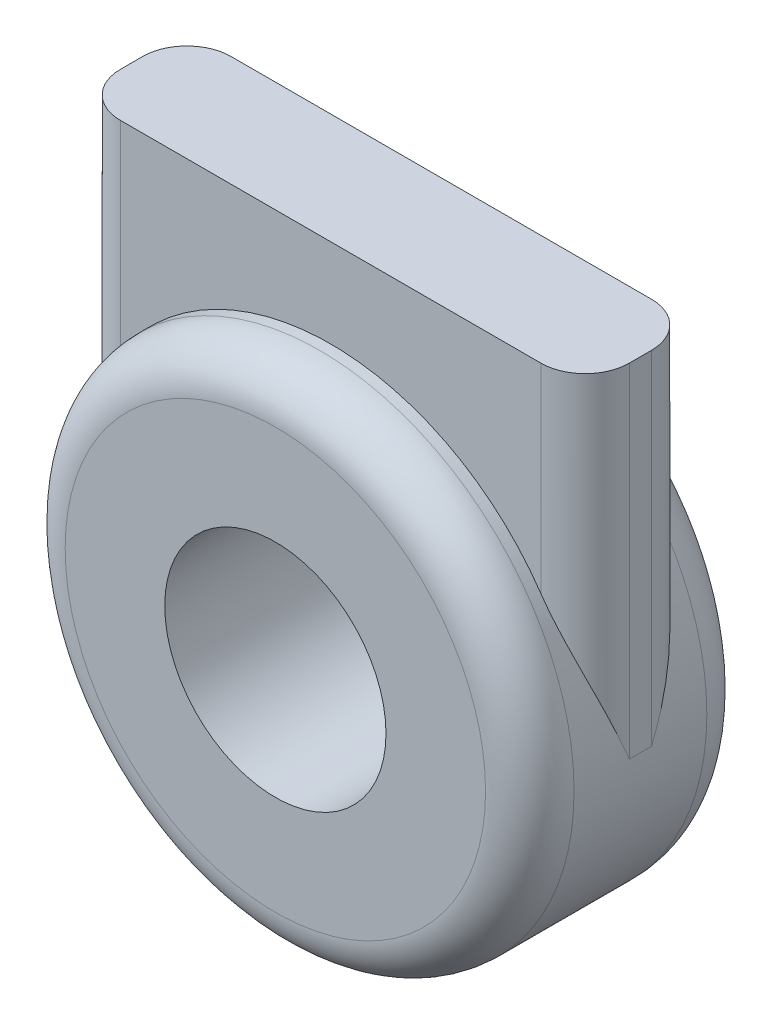
ISO-10303-21;
HEADER;
FILE_DESCRIPTION(('STEP AP214'),'2;1');
FILE_NAME('part.step','',(''),(''),'','','');
FILE_SCHEMA(('AUTOMOTIVE_DESIGN { 1 0 10303 214 1 1 1 1 }'));
ENDSEC;
DATA;
#1=APPLICATION_CONTEXT('core data for automotive mechanical design processes');
#2=APPLICATION_PROTOCOL_DEFINITION('international standard','automotive_design',2000,#1);
#3=PRODUCT_CONTEXT('',#1,'mechanical');
#4=PRODUCT('Part','Part','',(#3));
#5=PRODUCT_RELATED_PRODUCT_CATEGORY('part','',(#4));
#6=PRODUCT_DEFINITION_FORMATION('','',#4);
#7=PRODUCT_DEFINITION_CONTEXT('part definition',#1,'design');
#8=PRODUCT_DEFINITION('design','',#6,#7);
#9=PRODUCT_DEFINITION_SHAPE('','',#8);
#10=(LENGTH_UNIT() NAMED_UNIT(*) SI_UNIT(.MILLI.,.METRE.));
#11=(NAMED_UNIT(*) PLANE_ANGLE_UNIT() SI_UNIT($,.RADIAN.));
#12=(NAMED_UNIT(*) SI_UNIT($,.STERADIAN.) SOLID_ANGLE_UNIT());
#13=UNCERTAINTY_MEASURE_WITH_UNIT(LENGTH_MEASURE(1.E-05),#10,'distance_accuracy_value','');
#14=(GEOMETRIC_REPRESENTATION_CONTEXT(3) GLOBAL_UNCERTAINTY_ASSIGNED_CONTEXT((#13)) GLOBAL_UNIT_ASSIGNED_CONTEXT((#10,
#11,#12)) REPRESENTATION_CONTEXT('',''));
#15=CARTESIAN_POINT('',(0.,0.,0.));
#16=DIRECTION('',(0.,0.,1.));
#17=DIRECTION('',(1.,0.,0.));
#18=AXIS2_PLACEMENT_3D('',#15,#16,#17);
#19=CARTESIAN_POINT('',(0.,0.,-2.5));
#20=DIRECTION('',(0.,0.,-1.));
#21=DIRECTION('',(-1.,0.,0.));
#22=AXIS2_PLACEMENT_3D('',#19,#20,#21);
#23=PLANE('',#22);
#24=CARTESIAN_POINT('',(0.,0.,-2.5));
#25=DIRECTION('',(0.,0.,-1.));
#26=DIRECTION('',(-1.,0.,0.));
#27=AXIS2_PLACEMENT_3D('',#24,#25,#26);
#28=CIRCLE('',#27,9.5);
#29=CARTESIAN_POINT('',(-9.5,0.,-2.5));
#30=VERTEX_POINT('',#29);
#31=EDGE_CURVE('E117',#30,#30,#28,.T.);
#32=ORIENTED_EDGE('',*,*,#31,.T.);
#33=EDGE_LOOP('',(#32));
#34=FACE_BOUND('',#33,.T.);
#35=CARTESIAN_POINT('',(0.,0.,-2.5));
#36=DIRECTION('',(0.,0.,-1.));
#37=DIRECTION('',(-1.,0.,0.));
#38=AXIS2_PLACEMENT_3D('',#35,#36,#37);
#39=CIRCLE('',#38,5.);
#40=CARTESIAN_POINT('',(-5.,0.,-2.5));
#41=VERTEX_POINT('',#40);
#42=EDGE_CURVE('E216',#41,#41,#39,.T.);
#43=ORIENTED_EDGE('',*,*,#42,.F.);
#44=EDGE_LOOP('',(#43));
#45=FACE_BOUND('',#44,.T.);
#46=ADVANCED_FACE('F37',(#34,#45),#23,.T.);
#47=CARTESIAN_POINT('',(0.,15.5,5.));
#48=DIRECTION('',(0.,1.,0.));
#49=DIRECTION('',(0.,0.,1.));
#50=AXIS2_PLACEMENT_3D('',#47,#48,#49);
#51=PLANE('',#50);
#52=DIRECTION('',(0.,0.,-1.));
#53=VECTOR('',#52,1.);
#54=CARTESIAN_POINT('',(-11.5,15.5,5.));
#55=LINE('',#54,#53);
#56=CARTESIAN_POINT('',(-11.5,15.5,3.));
#57=VERTEX_POINT('',#56);
#58=CARTESIAN_POINT('',(-11.5,15.5,2.));
#59=VERTEX_POINT('',#58);
#60=EDGE_CURVE('E127',#57,#59,#55,.T.);
#61=ORIENTED_EDGE('',*,*,#60,.F.);
#62=CARTESIAN_POINT('',(-9.5,15.5,3.));
#63=DIRECTION('',(0.,1.,0.));
#64=DIRECTION('',(0.,0.,1.));
#65=AXIS2_PLACEMENT_3D('',#62,#63,#64);
#66=CIRCLE('',#65,2.);
#67=CARTESIAN_POINT('',(-9.5,15.5,5.));
#68=VERTEX_POINT('',#67);
#69=EDGE_CURVE('E131',#57,#68,#66,.T.);
#70=ORIENTED_EDGE('',*,*,#69,.T.);
#71=DIRECTION('',(1.,0.,0.));
#72=VECTOR('',#71,1.);
#73=CARTESIAN_POINT('',(0.,15.5,5.));
#74=LINE('',#73,#72);
#75=CARTESIAN_POINT('',(9.5,15.5,5.));
#76=VERTEX_POINT('',#75);
#77=EDGE_CURVE('E128',#68,#76,#74,.T.);
#78=ORIENTED_EDGE('',*,*,#77,.T.);
#79=CARTESIAN_POINT('',(9.5,15.5,3.));
#80=DIRECTION('',(0.,1.,0.));
#81=DIRECTION('',(0.,0.,1.));
#82=AXIS2_PLACEMENT_3D('',#79,#80,#81);
#83=CIRCLE('',#82,2.);
#84=CARTESIAN_POINT('',(11.5,15.5,3.));
#85=VERTEX_POINT('',#84);
#86=EDGE_CURVE('E132',#76,#85,#83,.T.);
#87=ORIENTED_EDGE('',*,*,#86,.T.);
#88=DIRECTION('',(0.,0.,-1.));
#89=VECTOR('',#88,1.);
#90=CARTESIAN_POINT('',(11.5,15.5,5.));
#91=LINE('',#90,#89);
#92=CARTESIAN_POINT('',(11.5,15.5,2.));
#93=VERTEX_POINT('',#92);
#94=EDGE_CURVE('E152',#85,#93,#91,.T.);
#95=ORIENTED_EDGE('',*,*,#94,.T.);
#96=CARTESIAN_POINT('',(9.5,15.5,2.));
#97=DIRECTION('',(0.,1.,0.));
#98=DIRECTION('',(0.,0.,1.));
#99=AXIS2_PLACEMENT_3D('',#96,#97,#98);
#100=CIRCLE('',#99,2.);
#101=CARTESIAN_POINT('',(9.5,15.5,0.));
#102=VERTEX_POINT('',#101);
#103=EDGE_CURVE('E134',#93,#102,#100,.T.);
#104=ORIENTED_EDGE('',*,*,#103,.T.);
#105=DIRECTION('',(1.,0.,0.));
#106=VECTOR('',#105,1.);
#107=CARTESIAN_POINT('',(0.,15.5,0.));
#108=LINE('',#107,#106);
#109=CARTESIAN_POINT('',(-9.5,15.5,0.));
#110=VERTEX_POINT('',#109);
#111=EDGE_CURVE('E146',#110,#102,#108,.T.);
#112=ORIENTED_EDGE('',*,*,#111,.F.);
#113=CARTESIAN_POINT('',(-9.5,15.5,2.));
#114=DIRECTION('',(0.,1.,0.));
#115=DIRECTION('',(0.,0.,1.));
#116=AXIS2_PLACEMENT_3D('',#113,#114,#115);
#117=CIRCLE('',#116,2.);
#118=EDGE_CURVE('E140',#110,#59,#117,.T.);
#119=ORIENTED_EDGE('',*,*,#118,.T.);
#120=EDGE_LOOP('',(#61,#70,#78,#87,#95,#104,#112,#119));
#121=FACE_BOUND('',#120,.T.);
#122=ADVANCED_FACE('F226',(#121),#51,.T.);
#123=CARTESIAN_POINT('',(0.,0.,7.5));
#124=DIRECTION('',(0.,0.,1.));
#125=DIRECTION('',(1.,0.,0.));
#126=AXIS2_PLACEMENT_3D('',#123,#124,#125);
#127=PLANE('',#126);
#128=CARTESIAN_POINT('',(0.,0.,7.5));
#129=DIRECTION('',(0.,0.,1.));
#130=DIRECTION('',(1.,0.,0.));
#131=AXIS2_PLACEMENT_3D('',#128,#129,#130);
#132=CIRCLE('',#131,9.5);
#133=CARTESIAN_POINT('',(9.5,0.,7.5));
#134=VERTEX_POINT('',#133);
#135=EDGE_CURVE('E167',#134,#134,#132,.T.);
#136=ORIENTED_EDGE('',*,*,#135,.T.);
#137=EDGE_LOOP('',(#136));
#138=FACE_BOUND('',#137,.T.);
#139=CARTESIAN_POINT('',(0.,0.,7.5));
#140=DIRECTION('',(0.,0.,1.));
#141=DIRECTION('',(1.,0.,0.));
#142=AXIS2_PLACEMENT_3D('',#139,#140,#141);
#143=CIRCLE('',#142,5.);
#144=CARTESIAN_POINT('',(5.,0.,7.5));
#145=VERTEX_POINT('',#144);
#146=EDGE_CURVE('E238',#145,#145,#143,.T.);
#147=ORIENTED_EDGE('',*,*,#146,.F.);
#148=EDGE_LOOP('',(#147));
#149=FACE_BOUND('',#148,.T.);
#150=ADVANCED_FACE('F243',(#138,#149),#127,.T.);
#151=CARTESIAN_POINT('',(-11.5,0.,5.));
#152=DIRECTION('',(-1.,0.,0.));
#153=DIRECTION('',(0.,0.,1.));
#154=AXIS2_PLACEMENT_3D('',#151,#152,#153);
#155=PLANE('',#154);
#156=DIRECTION('',(0.,0.,-1.));
#157=VECTOR('',#156,1.);
#158=CARTESIAN_POINT('',(-11.5,0.,5.));
#159=LINE('',#158,#157);
#160=CARTESIAN_POINT('',(-11.5,0.,3.));
#161=VERTEX_POINT('',#160);
#162=CARTESIAN_POINT('',(-11.5,0.,2.));
#163=VERTEX_POINT('',#162);
#164=EDGE_CURVE('E109',#161,#163,#159,.T.);
#165=ORIENTED_EDGE('',*,*,#164,.F.);
#166=DIRECTION('',(0.,1.,0.));
#167=VECTOR('',#166,1.);
#168=CARTESIAN_POINT('',(-11.5,0.,3.));
#169=LINE('',#168,#167);
#170=EDGE_CURVE('E123',#161,#57,#169,.T.);
#171=ORIENTED_EDGE('',*,*,#170,.T.);
#172=ORIENTED_EDGE('',*,*,#60,.T.);
#173=DIRECTION('',(0.,1.,0.));
#174=VECTOR('',#173,1.);
#175=CARTESIAN_POINT('',(-11.5,0.,2.));
#176=LINE('',#175,#174);
#177=EDGE_CURVE('E126',#59,#163,#176,.F.);
#178=ORIENTED_EDGE('',*,*,#177,.T.);
#179=EDGE_LOOP('',(#165,#171,#172,#178));
#180=FACE_BOUND('',#179,.T.);
#181=ADVANCED_FACE('F121',(#180),#155,.T.);
#182=CARTESIAN_POINT('',(0.,0.,5.));
#183=DIRECTION('',(0.,0.,1.));
#184=DIRECTION('',(1.,0.,0.));
#185=AXIS2_PLACEMENT_3D('',#182,#183,#184);
#186=PLANE('',#185);
#187=ORIENTED_EDGE('',*,*,#77,.F.);
#188=DIRECTION('',(0.,1.,0.));
#189=VECTOR('',#188,1.);
#190=CARTESIAN_POINT('',(-9.5,0.,5.));
#191=LINE('',#190,#189);
#192=CARTESIAN_POINT('',(-9.5,6.48074069840786,5.));
#193=VERTEX_POINT('',#192);
#194=EDGE_CURVE('E218',#68,#193,#191,.F.);
#195=ORIENTED_EDGE('',*,*,#194,.T.);
#196=CARTESIAN_POINT('',(0.,0.,5.));
#197=DIRECTION('',(0.,0.,1.));
#198=DIRECTION('',(1.,0.,0.));
#199=AXIS2_PLACEMENT_3D('',#196,#197,#198);
#200=CIRCLE('',#199,11.5);
#201=CARTESIAN_POINT('',(9.5,6.48074069840786,5.));
#202=VERTEX_POINT('',#201);
#203=EDGE_CURVE('E112',#202,#193,#200,.T.);
#204=ORIENTED_EDGE('',*,*,#203,.F.);
#205=DIRECTION('',(0.,-1.,0.));
#206=VECTOR('',#205,1.);
#207=CARTESIAN_POINT('',(9.5,0.,5.));
#208=LINE('',#207,#206);
#209=EDGE_CURVE('E143',#202,#76,#208,.F.);
#210=ORIENTED_EDGE('',*,*,#209,.T.);
#211=EDGE_LOOP('',(#187,#195,#204,#210));
#212=FACE_BOUND('',#211,.T.);
#213=ADVANCED_FACE('F223',(#212),#186,.T.);
#214=CARTESIAN_POINT('',(0.,0.,0.));
#215=DIRECTION('',(0.,0.,1.));
#216=DIRECTION('',(1.,0.,0.));
#217=AXIS2_PLACEMENT_3D('',#214,#215,#216);
#218=PLANE('',#217);
#219=CARTESIAN_POINT('',(0.,0.,0.));
#220=DIRECTION('',(0.,0.,-1.));
#221=DIRECTION('',(-1.,0.,0.));
#222=AXIS2_PLACEMENT_3D('',#219,#220,#221);
#223=CIRCLE('',#222,11.5);
#224=CARTESIAN_POINT('',(-9.5,6.48074069840786,0.));
#225=VERTEX_POINT('',#224);
#226=CARTESIAN_POINT('',(9.5,6.48074069840786,0.));
#227=VERTEX_POINT('',#226);
#228=EDGE_CURVE('E147',#225,#227,#223,.T.);
#229=ORIENTED_EDGE('',*,*,#228,.F.);
#230=DIRECTION('',(0.,1.,0.));
#231=VECTOR('',#230,1.);
#232=CARTESIAN_POINT('',(-9.5,15.5,0.));
#233=LINE('',#232,#231);
#234=EDGE_CURVE('E161',#225,#110,#233,.T.);
#235=ORIENTED_EDGE('',*,*,#234,.T.);
#236=ORIENTED_EDGE('',*,*,#111,.T.);
#237=DIRECTION('',(0.,-1.,0.));
#238=VECTOR('',#237,1.);
#239=CARTESIAN_POINT('',(9.5,0.,0.));
#240=LINE('',#239,#238);
#241=EDGE_CURVE('E215',#102,#227,#240,.T.);
#242=ORIENTED_EDGE('',*,*,#241,.T.);
#243=EDGE_LOOP('',(#229,#235,#236,#242));
#244=FACE_BOUND('',#243,.T.);
#245=ADVANCED_FACE('F211',(#244),#218,.F.);
#246=CARTESIAN_POINT('',(11.5,0.,5.));
#247=DIRECTION('',(1.,0.,0.));
#248=DIRECTION('',(0.,1.,0.));
#249=AXIS2_PLACEMENT_3D('',#246,#247,#248);
#250=PLANE('',#249);
#251=DIRECTION('',(0.,0.,-1.));
#252=VECTOR('',#251,1.);
#253=CARTESIAN_POINT('',(11.5,0.,5.));
#254=LINE('',#253,#252);
#255=CARTESIAN_POINT('',(11.5,0.,3.));
#256=VERTEX_POINT('',#255);
#257=CARTESIAN_POINT('',(11.5,0.,2.));
#258=VERTEX_POINT('',#257);
#259=EDGE_CURVE('E136',#256,#258,#254,.T.);
#260=ORIENTED_EDGE('',*,*,#259,.T.);
#261=DIRECTION('',(0.,-1.,0.));
#262=VECTOR('',#261,1.);
#263=CARTESIAN_POINT('',(11.5,15.5,2.));
#264=LINE('',#263,#262);
#265=EDGE_CURVE('E165',#258,#93,#264,.F.);
#266=ORIENTED_EDGE('',*,*,#265,.T.);
#267=ORIENTED_EDGE('',*,*,#94,.F.);
#268=DIRECTION('',(0.,-1.,0.));
#269=VECTOR('',#268,1.);
#270=CARTESIAN_POINT('',(11.5,0.,3.));
#271=LINE('',#270,#269);
#272=EDGE_CURVE('E163',#85,#256,#271,.T.);
#273=ORIENTED_EDGE('',*,*,#272,.T.);
#274=EDGE_LOOP('',(#260,#266,#267,#273));
#275=FACE_BOUND('',#274,.T.);
#276=ADVANCED_FACE('F231',(#275),#250,.T.);
#277=CARTESIAN_POINT('',(0.,0.,5.));
#278=DIRECTION('',(0.,0.,-1.));
#279=DIRECTION('',(-1.,0.,0.));
#280=AXIS2_PLACEMENT_3D('',#277,#278,#279);
#281=CYLINDRICAL_SURFACE('',#280,11.5);
#282=CARTESIAN_POINT('',(0.,0.,5.5));
#283=DIRECTION('',(0.,0.,1.));
#284=DIRECTION('',(1.,0.,0.));
#285=AXIS2_PLACEMENT_3D('',#282,#283,#284);
#286=CIRCLE('',#285,11.5);
#287=CARTESIAN_POINT('',(11.5,0.,5.5));
#288=VERTEX_POINT('',#287);
#289=EDGE_CURVE('E173',#288,#288,#286,.F.);
#290=ORIENTED_EDGE('',*,*,#289,.T.);
#291=EDGE_LOOP('',(#290));
#292=FACE_BOUND('',#291,.T.);
#293=CARTESIAN_POINT('',(0.,0.,-0.5));
#294=DIRECTION('',(0.,0.,-1.));
#295=DIRECTION('',(-1.,0.,0.));
#296=AXIS2_PLACEMENT_3D('',#293,#294,#295);
#297=CIRCLE('',#296,11.5);
#298=CARTESIAN_POINT('',(-11.5,0.,-0.5));
#299=VERTEX_POINT('',#298);
#300=EDGE_CURVE('E170',#299,#299,#297,.F.);
#301=ORIENTED_EDGE('',*,*,#300,.T.);
#302=EDGE_LOOP('',(#301));
#303=FACE_BOUND('',#302,.T.);
#304=ORIENTED_EDGE('',*,*,#203,.T.);
#305=CARTESIAN_POINT('',(-9.5,6.48074069840786,5.));
#306=CARTESIAN_POINT('',(-9.5478998749684,6.41052709090792,4.99999485050347));
#307=CARTESIAN_POINT('',(-9.59500859326845,6.33979700063751,4.99827987770957));
#308=CARTESIAN_POINT('',(-9.68757144627667,6.19743184077567,4.99172620239772));
#309=CARTESIAN_POINT('',(-9.73302605271472,6.12579703717194,4.98688839796124));
#310=CARTESIAN_POINT('',(-9.86667981248157,5.90992674266108,4.96815534415055));
#311=CARTESIAN_POINT('',(-9.95234236401309,5.76447092918012,4.95003828360823));
#312=CARTESIAN_POINT('',(-10.1161178996774,5.47193878983311,4.90462031399317));
#313=CARTESIAN_POINT('',(-10.1942711494418,5.32487643486576,4.87737236473033));
#314=CARTESIAN_POINT('',(-10.3435621983339,5.02874135788035,4.81519701224354));
#315=CARTESIAN_POINT('',(-10.4146956852112,4.87966746329609,4.78026493066493));
#316=CARTESIAN_POINT('',(-10.6001196114825,4.46872341409535,4.67572403542494));
#317=CARTESIAN_POINT('',(-10.7072580243306,4.20525217767262,4.59962044454687));
#318=CARTESIAN_POINT('',(-10.9006172486684,3.67508577592999,4.43336266720682));
#319=CARTESIAN_POINT('',(-10.98682746165,3.40838904862102,4.34320139942092));
#320=CARTESIAN_POINT('',(-11.1391189862411,2.8719369451306,4.15248667036028));
#321=CARTESIAN_POINT('',(-11.2051318970206,2.6021743153863,4.05189940635539));
#322=CARTESIAN_POINT('',(-11.3171195716652,2.06132102512497,3.84381802959838));
#323=CARTESIAN_POINT('',(-11.3631023817394,1.79023094219024,3.73632671019393));
#324=CARTESIAN_POINT('',(-11.4325236662301,1.26916821028002,3.52593720431417));
#325=CARTESIAN_POINT('',(-11.4574846441982,1.01926081527984,3.42337061797188));
#326=CARTESIAN_POINT('',(-11.4909853461503,0.519480661851203,3.2166174888031));
#327=CARTESIAN_POINT('',(-11.4995530196985,0.269608572050475,3.11243400904657));
#328=CARTESIAN_POINT('',(-11.4999943192753,0.0131967930175559,3.0055034424257));
#329=CARTESIAN_POINT('',(-11.4999999981066,0.00659837366513182,3.00275171130042));
#330=CARTESIAN_POINT('',(-11.5,0.,3.));
#331=B_SPLINE_CURVE_WITH_KNOTS('',3,(#305,#306,#307,#308,#309,#310,#311,#312,#313,#314,#315,
#316,#317,#318,#319,#320,#321,#322,#323,#324,#325,#326,#327,#328,#329,#330),.UNSPECIFIED.,.F.,
.F.,(4,2,2,2,2,2,2,2,2,2,2,2,4),(0.,0.254934546452708,0.509795810040033,1.01859735209689,
1.52449746561096,2.03070644461563,2.9126112766684,3.79496179767327,4.68026825754025,
5.56521875590217,6.3785992817118,7.19059180431662,7.21203942167291),.UNSPECIFIED.);
#332=EDGE_CURVE('E106',#193,#161,#331,.T.);
#333=ORIENTED_EDGE('',*,*,#332,.T.);
#334=ORIENTED_EDGE('',*,*,#164,.T.);
#335=CARTESIAN_POINT('',(-9.5,6.48074069840786,0.));
#336=CARTESIAN_POINT('',(-9.5478998749684,6.41052709090792,5.14949653226E-06));
#337=CARTESIAN_POINT('',(-9.59500859326845,6.33979700063751,0.00172012229043415));
#338=CARTESIAN_POINT('',(-9.68757144627666,6.19743184077567,0.00827379760228475));
#339=CARTESIAN_POINT('',(-9.73302605271471,6.12579703717195,0.0131116020387644));
#340=CARTESIAN_POINT('',(-9.86667981248157,5.90992674266109,0.0318446558494498));
#341=CARTESIAN_POINT('',(-9.95234236401309,5.76447092918013,0.0499617163917725));
#342=CARTESIAN_POINT('',(-10.1161178996774,5.47193878983312,0.0953796860068248));
#343=CARTESIAN_POINT('',(-10.1942711494417,5.32487643486577,0.122627635269665));
#344=CARTESIAN_POINT('',(-10.3435621983339,5.02874135788035,0.184802987756457));
#345=CARTESIAN_POINT('',(-10.4146956852112,4.87966746329609,0.219735069335067));
#346=CARTESIAN_POINT('',(-10.6001196114825,4.46872341409535,0.324275964575057));
#347=CARTESIAN_POINT('',(-10.7072580243306,4.20525217767261,0.400379555453128));
#348=CARTESIAN_POINT('',(-10.9006172486684,3.67508577592998,0.56663733279318));
#349=CARTESIAN_POINT('',(-10.98682746165,3.40838904862102,0.656798600579087));
#350=CARTESIAN_POINT('',(-11.1391189862411,2.87193694513059,0.847513329639718));
#351=CARTESIAN_POINT('',(-11.2051318970206,2.60217431538629,0.948100593644609));
#352=CARTESIAN_POINT('',(-11.3171195716652,2.06132102512497,1.15618197040162));
#353=CARTESIAN_POINT('',(-11.3631023817394,1.79023094219025,1.26367328980609));
#354=CARTESIAN_POINT('',(-11.4325236662301,1.26916821028001,1.47406279568581));
#355=CARTESIAN_POINT('',(-11.4574846441982,1.01926081527982,1.57662938202807));
#356=CARTESIAN_POINT('',(-11.4909853461503,0.519480661851228,1.78338251119696));
#357=CARTESIAN_POINT('',(-11.4995530196985,0.269608572050559,1.88756599095363));
#358=CARTESIAN_POINT('',(-11.4999943192753,0.0131967930175601,1.99449655757431));
#359=CARTESIAN_POINT('',(-11.4999999981066,0.00659837366513399,1.99724828869958));
#360=CARTESIAN_POINT('',(-11.5,0.,2.));
#361=B_SPLINE_CURVE_WITH_KNOTS('',3,(#335,#336,#337,#338,#339,#340,#341,#342,#343,#344,#345,
#346,#347,#348,#349,#350,#351,#352,#353,#354,#355,#356,#357,#358,#359,#360),.UNSPECIFIED.,.F.,
.F.,(4,2,2,2,2,2,2,2,2,2,2,2,4),(0.,0.254934546452704,0.509795810040024,1.01859735209687,
1.52449746561095,2.03070644461563,2.9126112766684,3.79496179767328,4.68026825754026,
5.56521875590217,6.3785992817118,7.19059180431663,7.21203942167291),.UNSPECIFIED.);
#362=EDGE_CURVE('E116',#163,#225,#361,.F.);
#363=ORIENTED_EDGE('',*,*,#362,.T.);
#364=ORIENTED_EDGE('',*,*,#228,.T.);
#365=CARTESIAN_POINT('',(9.5,6.48074069840786,0.));
#366=CARTESIAN_POINT('',(9.5478998749684,6.41052709090792,5.1494965320404E-06));
#367=CARTESIAN_POINT('',(9.59500859326845,6.33979700063752,0.00172012229043371));
#368=CARTESIAN_POINT('',(9.68757144627665,6.19743184077568,0.00827379760228373));
#369=CARTESIAN_POINT('',(9.7330260527147,6.12579703717196,0.013111602038763));
#370=CARTESIAN_POINT('',(9.86667981248155,5.90992674266112,0.0318446558494469));
#371=CARTESIAN_POINT('',(9.95234236401306,5.76447092918016,0.049961716391768));
#372=CARTESIAN_POINT('',(10.1161178996773,5.47193878983315,0.0953796860068179));
#373=CARTESIAN_POINT('',(10.1942711494417,5.3248764348658,0.122627635269658));
#374=CARTESIAN_POINT('',(10.3435621983339,5.02874135788036,0.184802987756453));
#375=CARTESIAN_POINT('',(10.4146956852112,4.8796674632961,0.219735069335065));
#376=CARTESIAN_POINT('',(10.6001196114825,4.46872341409534,0.324275964575059));
#377=CARTESIAN_POINT('',(10.7072580243306,4.2052521776726,0.40037955545313));
#378=CARTESIAN_POINT('',(10.9006172486684,3.67508577592996,0.566637332793189));
#379=CARTESIAN_POINT('',(10.98682746165,3.40838904862099,0.656798600579102));
#380=CARTESIAN_POINT('',(11.1391189862411,2.87193694513056,0.847513329639725));
#381=CARTESIAN_POINT('',(11.2051318970206,2.60217431538626,0.948100593644602));
#382=CARTESIAN_POINT('',(11.3171195716652,2.06132102512496,1.15618197040165));
#383=CARTESIAN_POINT('',(11.3631023817394,1.79023094219026,1.26367328980615));
#384=CARTESIAN_POINT('',(11.4325236662301,1.26916821027998,1.47406279568575));
#385=CARTESIAN_POINT('',(11.4574846441982,1.01926081527973,1.57662938202786));
#386=CARTESIAN_POINT('',(11.4909853461503,0.519480661851307,1.78338251119716));
#387=CARTESIAN_POINT('',(11.4995530196985,0.26960857205087,1.88756599095438));
#388=CARTESIAN_POINT('',(11.4999943192753,0.0131967930175746,1.99449655757435));
#389=CARTESIAN_POINT('',(11.4999999981066,0.00659837366514056,1.9972482886996));
#390=CARTESIAN_POINT('',(11.5,0.,2.));
#391=B_SPLINE_CURVE_WITH_KNOTS('',3,(#365,#366,#367,#368,#369,#370,#371,#372,#373,#374,#375,
#376,#377,#378,#379,#380,#381,#382,#383,#384,#385,#386,#387,#388,#389,#390),.UNSPECIFIED.,.F.,
.F.,(4,2,2,2,2,2,2,2,2,2,2,2,4),(0.,0.254934546452692,0.509795810039998,1.01859735209682,
1.52449746561093,2.03070644461563,2.91261127666842,3.79496179767331,4.68026825754028,
5.56521875590218,6.3785992817118,7.19059180431662,7.21203942167291),.UNSPECIFIED.);
#392=EDGE_CURVE('E50',#227,#258,#391,.T.);
#393=ORIENTED_EDGE('',*,*,#392,.T.);
#394=ORIENTED_EDGE('',*,*,#259,.F.);
#395=CARTESIAN_POINT('',(9.5,6.48074069840786,5.));
#396=CARTESIAN_POINT('',(9.5478998749684,6.41052709090792,4.99999485050347));
#397=CARTESIAN_POINT('',(9.59500859326845,6.33979700063751,4.99827987770957));
#398=CARTESIAN_POINT('',(9.68757144627666,6.19743184077567,4.99172620239772));
#399=CARTESIAN_POINT('',(9.73302605271472,6.12579703717194,4.98688839796124));
#400=CARTESIAN_POINT('',(9.86667981248157,5.90992674266109,4.96815534415055));
#401=CARTESIAN_POINT('',(9.95234236401309,5.76447092918012,4.95003828360823));
#402=CARTESIAN_POINT('',(10.1161178996774,5.47193878983311,4.90462031399317));
#403=CARTESIAN_POINT('',(10.1942711494418,5.32487643486576,4.87737236473034));
#404=CARTESIAN_POINT('',(10.3435621983339,5.02874135788035,4.81519701224354));
#405=CARTESIAN_POINT('',(10.4146956852112,4.87966746329609,4.78026493066493));
#406=CARTESIAN_POINT('',(10.6001196114825,4.46872341409535,4.67572403542494));
#407=CARTESIAN_POINT('',(10.7072580243306,4.20525217767261,4.59962044454687));
#408=CARTESIAN_POINT('',(10.9006172486684,3.67508577592998,4.43336266720682));
#409=CARTESIAN_POINT('',(10.98682746165,3.40838904862101,4.34320139942091));
#410=CARTESIAN_POINT('',(11.1391189862411,2.87193694513059,4.15248667036028));
#411=CARTESIAN_POINT('',(11.2051318970206,2.60217431538629,4.05189940635539));
#412=CARTESIAN_POINT('',(11.3171195716652,2.06132102512497,3.84381802959838));
#413=CARTESIAN_POINT('',(11.3631023817394,1.79023094219024,3.73632671019392));
#414=CARTESIAN_POINT('',(11.4325236662301,1.26916821028001,3.52593720431418));
#415=CARTESIAN_POINT('',(11.4574846441982,1.01926081527982,3.42337061797192));
#416=CARTESIAN_POINT('',(11.4909853461503,0.519480661851223,3.21661748880304));
#417=CARTESIAN_POINT('',(11.4995530196985,0.269608572050544,3.1124340090464));
#418=CARTESIAN_POINT('',(11.4999943192753,0.0131967930175579,3.00550344242569));
#419=CARTESIAN_POINT('',(11.4999999981066,0.00659837366513201,3.00275171130042));
#420=CARTESIAN_POINT('',(11.5,0.,3.));
#421=B_SPLINE_CURVE_WITH_KNOTS('',3,(#395,#396,#397,#398,#399,#400,#401,#402,#403,#404,#405,
#406,#407,#408,#409,#410,#411,#412,#413,#414,#415,#416,#417,#418,#419,#420),.UNSPECIFIED.,.F.,
.F.,(4,2,2,2,2,2,2,2,2,2,2,2,4),(0.,0.254934546452706,0.509795810040027,1.01859735209688,
1.52449746561095,2.03070644461563,2.9126112766684,3.79496179767328,4.68026825754026,
5.56521875590218,6.3785992817118,7.19059180431662,7.21203942167291),.UNSPECIFIED.);
#422=EDGE_CURVE('E11',#256,#202,#421,.F.);
#423=ORIENTED_EDGE('',*,*,#422,.T.);
#424=EDGE_LOOP('',(#304,#333,#334,#363,#364,#393,#394,#423));
#425=FACE_BOUND('',#424,.T.);
#426=ADVANCED_FACE('F108',(#292,#303,#425),#281,.T.);
#427=CARTESIAN_POINT('',(0.,0.,5.));
#428=DIRECTION('',(0.,0.,-1.));
#429=DIRECTION('',(-1.,0.,0.));
#430=AXIS2_PLACEMENT_3D('',#427,#428,#429);
#431=CYLINDRICAL_SURFACE('',#430,5.);
#432=ORIENTED_EDGE('',*,*,#42,.T.);
#433=EDGE_LOOP('',(#432));
#434=FACE_BOUND('',#433,.T.);
#435=ORIENTED_EDGE('',*,*,#146,.T.);
#436=EDGE_LOOP('',(#435));
#437=FACE_BOUND('',#436,.T.);
#438=ADVANCED_FACE('F192',(#434,#437),#431,.F.);
#439=CARTESIAN_POINT('',(-9.5,0.,3.));
#440=DIRECTION('',(0.,1.,0.));
#441=DIRECTION('',(0.,0.,1.));
#442=AXIS2_PLACEMENT_3D('',#439,#440,#441);
#443=CYLINDRICAL_SURFACE('',#442,2.);
#444=ORIENTED_EDGE('',*,*,#332,.F.);
#445=ORIENTED_EDGE('',*,*,#194,.F.);
#446=ORIENTED_EDGE('',*,*,#69,.F.);
#447=ORIENTED_EDGE('',*,*,#170,.F.);
#448=EDGE_LOOP('',(#444,#445,#446,#447));
#449=FACE_BOUND('',#448,.T.);
#450=ADVANCED_FACE('F130',(#449),#443,.T.);
#451=CARTESIAN_POINT('',(-9.5,0.,2.));
#452=DIRECTION('',(0.,-1.,0.));
#453=DIRECTION('',(0.,0.,-1.));
#454=AXIS2_PLACEMENT_3D('',#451,#452,#453);
#455=CYLINDRICAL_SURFACE('',#454,2.);
#456=ORIENTED_EDGE('',*,*,#362,.F.);
#457=ORIENTED_EDGE('',*,*,#177,.F.);
#458=ORIENTED_EDGE('',*,*,#118,.F.);
#459=ORIENTED_EDGE('',*,*,#234,.F.);
#460=EDGE_LOOP('',(#456,#457,#458,#459));
#461=FACE_BOUND('',#460,.T.);
#462=ADVANCED_FACE('F191',(#461),#455,.T.);
#463=CARTESIAN_POINT('',(9.5,0.,2.));
#464=DIRECTION('',(0.,1.,0.));
#465=DIRECTION('',(-1.,0.,0.));
#466=AXIS2_PLACEMENT_3D('',#463,#464,#465);
#467=CYLINDRICAL_SURFACE('',#466,2.);
#468=ORIENTED_EDGE('',*,*,#103,.F.);
#469=ORIENTED_EDGE('',*,*,#265,.F.);
#470=ORIENTED_EDGE('',*,*,#392,.F.);
#471=ORIENTED_EDGE('',*,*,#241,.F.);
#472=EDGE_LOOP('',(#468,#469,#470,#471));
#473=FACE_BOUND('',#472,.T.);
#474=ADVANCED_FACE('F196',(#473),#467,.T.);
#475=CARTESIAN_POINT('',(9.5,0.,3.));
#476=DIRECTION('',(0.,-1.,0.));
#477=DIRECTION('',(1.,0.,0.));
#478=AXIS2_PLACEMENT_3D('',#475,#476,#477);
#479=CYLINDRICAL_SURFACE('',#478,2.);
#480=ORIENTED_EDGE('',*,*,#86,.F.);
#481=ORIENTED_EDGE('',*,*,#209,.F.);
#482=ORIENTED_EDGE('',*,*,#422,.F.);
#483=ORIENTED_EDGE('',*,*,#272,.F.);
#484=EDGE_LOOP('',(#480,#481,#482,#483));
#485=FACE_BOUND('',#484,.T.);
#486=ADVANCED_FACE('F200',(#485),#479,.T.);
#487=CARTESIAN_POINT('',(0.,0.,5.5));
#488=DIRECTION('',(0.,0.,1.));
#489=DIRECTION('',(1.,0.,0.));
#490=AXIS2_PLACEMENT_3D('',#487,#488,#489);
#491=TOROIDAL_SURFACE('',#490,9.5,2.);
#492=ORIENTED_EDGE('',*,*,#289,.F.);
#493=EDGE_LOOP('',(#492));
#494=FACE_BOUND('',#493,.T.);
#495=ORIENTED_EDGE('',*,*,#135,.F.);
#496=EDGE_LOOP('',(#495));
#497=FACE_BOUND('',#496,.T.);
#498=ADVANCED_FACE('F277',(#494,#497),#491,.T.);
#499=CARTESIAN_POINT('',(0.,0.,-0.5));
#500=DIRECTION('',(0.,0.,-1.));
#501=DIRECTION('',(-1.,0.,0.));
#502=AXIS2_PLACEMENT_3D('',#499,#500,#501);
#503=TOROIDAL_SURFACE('',#502,9.5,2.);
#504=ORIENTED_EDGE('',*,*,#300,.F.);
#505=EDGE_LOOP('',(#504));
#506=FACE_BOUND('',#505,.T.);
#507=ORIENTED_EDGE('',*,*,#31,.F.);
#508=EDGE_LOOP('',(#507));
#509=FACE_BOUND('',#508,.T.);
#510=ADVANCED_FACE('F39',(#506,#509),#503,.T.);
#511=CLOSED_SHELL('',(#46,#122,#150,#181,#213,#245,#276,#426,#438,#450,#462,#474,#486,#498,#510));
#512=MANIFOLD_SOLID_BREP('B2',#511);
#513=ADVANCED_BREP_SHAPE_REPRESENTATION('',(#18,#512),#14);
#514=SHAPE_DEFINITION_REPRESENTATION(#9,#513);
ENDSEC;
END-ISO-10303-21;
